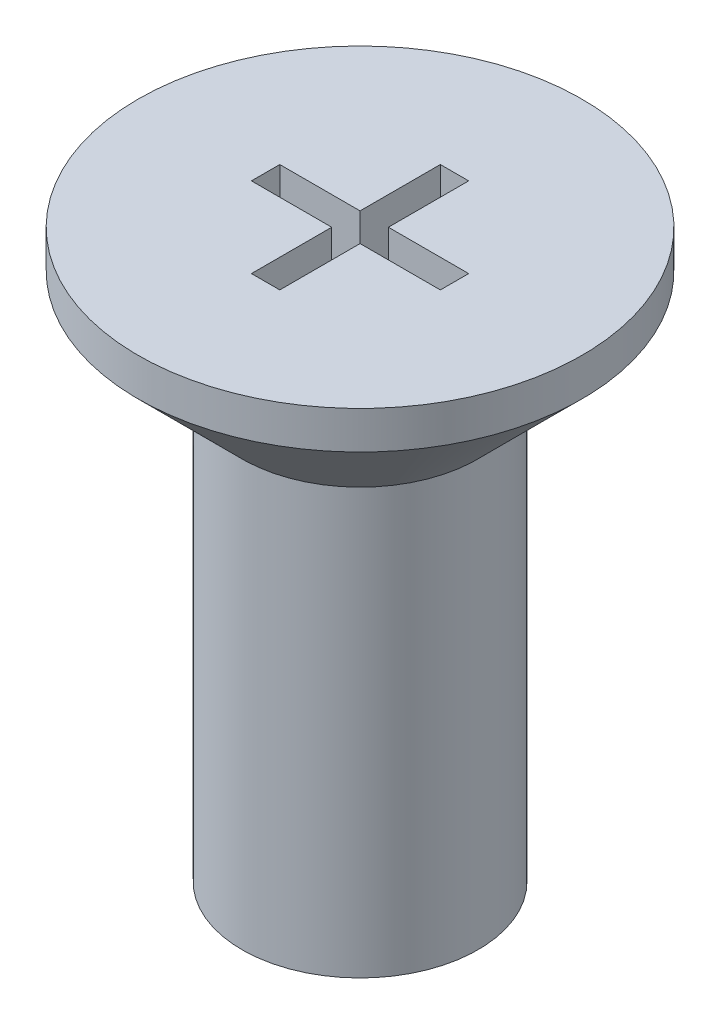
ISO-10303-21;
HEADER;
FILE_DESCRIPTION(('STEP AP214'),'2;1');
FILE_NAME('part.step','',(''),(''),'','','');
FILE_SCHEMA(('AUTOMOTIVE_DESIGN { 1 0 10303 214 1 1 1 1 }'));
ENDSEC;
DATA;
#1=APPLICATION_CONTEXT('core data for automotive mechanical design processes');
#2=APPLICATION_PROTOCOL_DEFINITION('international standard','automotive_design',2000,#1);
#3=PRODUCT_CONTEXT('',#1,'mechanical');
#4=PRODUCT('Part','Part','',(#3));
#5=PRODUCT_RELATED_PRODUCT_CATEGORY('part','',(#4));
#6=PRODUCT_DEFINITION_FORMATION('','',#4);
#7=PRODUCT_DEFINITION_CONTEXT('part definition',#1,'design');
#8=PRODUCT_DEFINITION('design','',#6,#7);
#9=PRODUCT_DEFINITION_SHAPE('','',#8);
#10=(LENGTH_UNIT() NAMED_UNIT(*) SI_UNIT(.MILLI.,.METRE.));
#11=(NAMED_UNIT(*) PLANE_ANGLE_UNIT() SI_UNIT($,.RADIAN.));
#12=(NAMED_UNIT(*) SI_UNIT($,.STERADIAN.) SOLID_ANGLE_UNIT());
#13=UNCERTAINTY_MEASURE_WITH_UNIT(LENGTH_MEASURE(1.E-05),#10,'distance_accuracy_value','');
#14=(GEOMETRIC_REPRESENTATION_CONTEXT(3) GLOBAL_UNCERTAINTY_ASSIGNED_CONTEXT((#13)) GLOBAL_UNIT_ASSIGNED_CONTEXT((#10,
#11,#12)) REPRESENTATION_CONTEXT('',''));
#15=CARTESIAN_POINT('',(0.,0.,0.));
#16=DIRECTION('',(0.,0.,1.));
#17=DIRECTION('',(1.,0.,0.));
#18=AXIS2_PLACEMENT_3D('',#15,#16,#17);
#19=CARTESIAN_POINT('',(0.,0.,0.));
#20=DIRECTION('',(0.,1.,0.));
#21=DIRECTION('',(-1.,0.,0.));
#22=AXIS2_PLACEMENT_3D('',#19,#20,#21);
#23=PLANE('',#22);
#24=CARTESIAN_POINT('',(0.,0.,0.));
#25=DIRECTION('',(0.,1.,0.));
#26=DIRECTION('',(-1.,0.,0.));
#27=AXIS2_PLACEMENT_3D('',#24,#25,#26);
#28=CIRCLE('',#27,1.25);
#29=CARTESIAN_POINT('',(-1.25,0.,0.));
#30=VERTEX_POINT('',#29);
#31=EDGE_CURVE('E11',#30,#30,#28,.T.);
#32=ORIENTED_EDGE('',*,*,#31,.F.);
#33=EDGE_LOOP('',(#32));
#34=FACE_BOUND('',#33,.T.);
#35=ADVANCED_FACE('F33',(#34),#23,.F.);
#36=CARTESIAN_POINT('',(0.,6.,0.));
#37=DIRECTION('',(0.,1.,0.));
#38=DIRECTION('',(-1.,0.,0.));
#39=AXIS2_PLACEMENT_3D('',#36,#37,#38);
#40=CYLINDRICAL_SURFACE('',#39,1.25);
#41=CARTESIAN_POINT('',(0.,4.5,0.));
#42=DIRECTION('',(0.,1.,0.));
#43=DIRECTION('',(-1.,0.,0.));
#44=AXIS2_PLACEMENT_3D('',#41,#42,#43);
#45=CIRCLE('',#44,1.25);
#46=CARTESIAN_POINT('',(-1.25,4.5,0.));
#47=VERTEX_POINT('',#46);
#48=EDGE_CURVE('E40',#47,#47,#45,.T.);
#49=ORIENTED_EDGE('',*,*,#48,.F.);
#50=EDGE_LOOP('',(#49));
#51=FACE_BOUND('',#50,.T.);
#52=ORIENTED_EDGE('',*,*,#31,.T.);
#53=EDGE_LOOP('',(#52));
#54=FACE_BOUND('',#53,.T.);
#55=ADVANCED_FACE('F214',(#51,#54),#40,.T.);
#56=CARTESIAN_POINT('',(0.,4.5,0.));
#57=DIRECTION('',(0.,1.,0.));
#58=DIRECTION('',(-1.,0.,0.));
#59=AXIS2_PLACEMENT_3D('',#56,#57,#58);
#60=CONICAL_SURFACE('',#59,1.25,0.78539816339745);
#61=CARTESIAN_POINT('',(0.,5.6,0.));
#62=DIRECTION('',(0.,1.,0.));
#63=DIRECTION('',(-1.,0.,0.));
#64=AXIS2_PLACEMENT_3D('',#61,#62,#63);
#65=CIRCLE('',#64,2.35);
#66=CARTESIAN_POINT('',(-2.35,5.6,0.));
#67=VERTEX_POINT('',#66);
#68=EDGE_CURVE('E207',#67,#67,#65,.T.);
#69=ORIENTED_EDGE('',*,*,#68,.F.);
#70=EDGE_LOOP('',(#69));
#71=FACE_BOUND('',#70,.T.);
#72=ORIENTED_EDGE('',*,*,#48,.T.);
#73=EDGE_LOOP('',(#72));
#74=FACE_BOUND('',#73,.T.);
#75=ADVANCED_FACE('F212',(#71,#74),#60,.T.);
#76=CARTESIAN_POINT('',(0.,6.,0.));
#77=DIRECTION('',(0.,1.,0.));
#78=DIRECTION('',(-1.,0.,0.));
#79=AXIS2_PLACEMENT_3D('',#76,#77,#78);
#80=CYLINDRICAL_SURFACE('',#79,2.35);
#81=CARTESIAN_POINT('',(0.,6.,0.));
#82=DIRECTION('',(0.,1.,0.));
#83=DIRECTION('',(-1.,0.,0.));
#84=AXIS2_PLACEMENT_3D('',#81,#82,#83);
#85=CIRCLE('',#84,2.35);
#86=CARTESIAN_POINT('',(-2.35,6.,0.));
#87=VERTEX_POINT('',#86);
#88=EDGE_CURVE('E187',#87,#87,#85,.T.);
#89=ORIENTED_EDGE('',*,*,#88,.F.);
#90=EDGE_LOOP('',(#89));
#91=FACE_BOUND('',#90,.T.);
#92=ORIENTED_EDGE('',*,*,#68,.T.);
#93=EDGE_LOOP('',(#92));
#94=FACE_BOUND('',#93,.T.);
#95=ADVANCED_FACE('F232',(#91,#94),#80,.T.);
#96=CARTESIAN_POINT('',(2.35,6.,0.));
#97=DIRECTION('',(0.,-1.,0.));
#98=DIRECTION('',(1.,0.,0.));
#99=AXIS2_PLACEMENT_3D('',#96,#97,#98);
#100=PLANE('',#99);
#101=DIRECTION('',(0.,0.,1.));
#102=VECTOR('',#101,1.);
#103=CARTESIAN_POINT('',(-0.15,6.,-0.15));
#104=LINE('',#103,#102);
#105=CARTESIAN_POINT('',(-0.15,6.,-1.));
#106=VERTEX_POINT('',#105);
#107=CARTESIAN_POINT('',(-0.15,6.,-0.15));
#108=VERTEX_POINT('',#107);
#109=EDGE_CURVE('E156',#106,#108,#104,.T.);
#110=ORIENTED_EDGE('',*,*,#109,.F.);
#111=DIRECTION('',(-1.,0.,0.));
#112=VECTOR('',#111,1.);
#113=CARTESIAN_POINT('',(0.,6.,-1.));
#114=LINE('',#113,#112);
#115=CARTESIAN_POINT('',(0.15,6.,-1.));
#116=VERTEX_POINT('',#115);
#117=EDGE_CURVE('E184',#116,#106,#114,.T.);
#118=ORIENTED_EDGE('',*,*,#117,.F.);
#119=DIRECTION('',(0.,0.,-1.));
#120=VECTOR('',#119,1.);
#121=CARTESIAN_POINT('',(0.15,6.,-1.));
#122=LINE('',#121,#120);
#123=CARTESIAN_POINT('',(0.15,6.,-0.15));
#124=VERTEX_POINT('',#123);
#125=EDGE_CURVE('E182',#124,#116,#122,.T.);
#126=ORIENTED_EDGE('',*,*,#125,.F.);
#127=DIRECTION('',(-1.,0.,0.));
#128=VECTOR('',#127,1.);
#129=CARTESIAN_POINT('',(0.15,6.,-0.15));
#130=LINE('',#129,#128);
#131=CARTESIAN_POINT('',(1.,6.,-0.15));
#132=VERTEX_POINT('',#131);
#133=EDGE_CURVE('E180',#132,#124,#130,.T.);
#134=ORIENTED_EDGE('',*,*,#133,.F.);
#135=DIRECTION('',(0.,0.,-1.));
#136=VECTOR('',#135,1.);
#137=CARTESIAN_POINT('',(1.,6.,-0.15));
#138=LINE('',#137,#136);
#139=CARTESIAN_POINT('',(1.,6.,0.15));
#140=VERTEX_POINT('',#139);
#141=EDGE_CURVE('E131',#140,#132,#138,.T.);
#142=ORIENTED_EDGE('',*,*,#141,.F.);
#143=DIRECTION('',(1.,0.,0.));
#144=VECTOR('',#143,1.);
#145=CARTESIAN_POINT('',(1.,6.,0.15));
#146=LINE('',#145,#144);
#147=CARTESIAN_POINT('',(0.15,6.,0.15));
#148=VERTEX_POINT('',#147);
#149=EDGE_CURVE('E176',#148,#140,#146,.T.);
#150=ORIENTED_EDGE('',*,*,#149,.F.);
#151=DIRECTION('',(0.,0.,-1.));
#152=VECTOR('',#151,1.);
#153=CARTESIAN_POINT('',(0.15,6.,0.15));
#154=LINE('',#153,#152);
#155=CARTESIAN_POINT('',(0.15,6.,1.));
#156=VERTEX_POINT('',#155);
#157=EDGE_CURVE('E173',#156,#148,#154,.T.);
#158=ORIENTED_EDGE('',*,*,#157,.F.);
#159=DIRECTION('',(1.,0.,0.));
#160=VECTOR('',#159,1.);
#161=CARTESIAN_POINT('',(0.15,6.,1.));
#162=LINE('',#161,#160);
#163=CARTESIAN_POINT('',(-0.15,6.,1.));
#164=VERTEX_POINT('',#163);
#165=EDGE_CURVE('E170',#164,#156,#162,.T.);
#166=ORIENTED_EDGE('',*,*,#165,.F.);
#167=DIRECTION('',(0.,0.,1.));
#168=VECTOR('',#167,1.);
#169=CARTESIAN_POINT('',(-0.15,6.,1.));
#170=LINE('',#169,#168);
#171=CARTESIAN_POINT('',(-0.15,6.,0.15));
#172=VERTEX_POINT('',#171);
#173=EDGE_CURVE('E167',#172,#164,#170,.T.);
#174=ORIENTED_EDGE('',*,*,#173,.F.);
#175=DIRECTION('',(1.,0.,0.));
#176=VECTOR('',#175,1.);
#177=CARTESIAN_POINT('',(-0.15,6.,0.15));
#178=LINE('',#177,#176);
#179=CARTESIAN_POINT('',(-1.,6.,0.15));
#180=VERTEX_POINT('',#179);
#181=EDGE_CURVE('E164',#180,#172,#178,.T.);
#182=ORIENTED_EDGE('',*,*,#181,.F.);
#183=DIRECTION('',(0.,0.,1.));
#184=VECTOR('',#183,1.);
#185=CARTESIAN_POINT('',(-1.,6.,0.15));
#186=LINE('',#185,#184);
#187=CARTESIAN_POINT('',(-1.,6.,-0.15));
#188=VERTEX_POINT('',#187);
#189=EDGE_CURVE('E161',#188,#180,#186,.T.);
#190=ORIENTED_EDGE('',*,*,#189,.F.);
#191=DIRECTION('',(-1.,0.,0.));
#192=VECTOR('',#191,1.);
#193=CARTESIAN_POINT('',(-1.,6.,-0.15));
#194=LINE('',#193,#192);
#195=EDGE_CURVE('E158',#108,#188,#194,.T.);
#196=ORIENTED_EDGE('',*,*,#195,.F.);
#197=EDGE_LOOP('',(#110,#118,#126,#134,#142,#150,#158,#166,#174,#182,#190,#196));
#198=FACE_BOUND('',#197,.T.);
#199=ORIENTED_EDGE('',*,*,#88,.T.);
#200=EDGE_LOOP('',(#199));
#201=FACE_BOUND('',#200,.T.);
#202=ADVANCED_FACE('F240',(#198,#201),#100,.F.);
#203=CARTESIAN_POINT('',(0.,5.,-1.));
#204=DIRECTION('',(0.,0.,-1.));
#205=DIRECTION('',(-1.,0.,0.));
#206=AXIS2_PLACEMENT_3D('',#203,#204,#205);
#207=PLANE('',#206);
#208=ORIENTED_EDGE('',*,*,#117,.T.);
#209=DIRECTION('',(0.,1.,0.));
#210=VECTOR('',#209,1.);
#211=CARTESIAN_POINT('',(-0.15,5.,-1.));
#212=LINE('',#211,#210);
#213=CARTESIAN_POINT('',(-0.15,5.,-1.));
#214=VERTEX_POINT('',#213);
#215=EDGE_CURVE('E47',#214,#106,#212,.T.);
#216=ORIENTED_EDGE('',*,*,#215,.F.);
#217=DIRECTION('',(-1.,0.,0.));
#218=VECTOR('',#217,1.);
#219=CARTESIAN_POINT('',(-0.15,5.,-1.));
#220=LINE('',#219,#218);
#221=CARTESIAN_POINT('',(0.15,5.,-1.));
#222=VERTEX_POINT('',#221);
#223=EDGE_CURVE('E55',#222,#214,#220,.T.);
#224=ORIENTED_EDGE('',*,*,#223,.F.);
#225=DIRECTION('',(0.,1.,0.));
#226=VECTOR('',#225,1.);
#227=CARTESIAN_POINT('',(0.15,5.,-1.));
#228=LINE('',#227,#226);
#229=EDGE_CURVE('E93',#222,#116,#228,.T.);
#230=ORIENTED_EDGE('',*,*,#229,.T.);
#231=EDGE_LOOP('',(#208,#216,#224,#230));
#232=FACE_BOUND('',#231,.T.);
#233=ADVANCED_FACE('F248',(#232),#207,.F.);
#234=CARTESIAN_POINT('',(0.15,5.,-1.));
#235=DIRECTION('',(1.,0.,0.));
#236=DIRECTION('',(0.,0.,-1.));
#237=AXIS2_PLACEMENT_3D('',#234,#235,#236);
#238=PLANE('',#237);
#239=ORIENTED_EDGE('',*,*,#125,.T.);
#240=ORIENTED_EDGE('',*,*,#229,.F.);
#241=DIRECTION('',(0.,0.,-1.));
#242=VECTOR('',#241,1.);
#243=CARTESIAN_POINT('',(0.15,5.,-1.));
#244=LINE('',#243,#242);
#245=CARTESIAN_POINT('',(0.15,5.,-0.15));
#246=VERTEX_POINT('',#245);
#247=EDGE_CURVE('E144',#246,#222,#244,.T.);
#248=ORIENTED_EDGE('',*,*,#247,.F.);
#249=DIRECTION('',(0.,1.,0.));
#250=VECTOR('',#249,1.);
#251=CARTESIAN_POINT('',(0.15,5.,-0.15));
#252=LINE('',#251,#250);
#253=EDGE_CURVE('E135',#246,#124,#252,.T.);
#254=ORIENTED_EDGE('',*,*,#253,.T.);
#255=EDGE_LOOP('',(#239,#240,#248,#254));
#256=FACE_BOUND('',#255,.T.);
#257=ADVANCED_FACE('F256',(#256),#238,.F.);
#258=CARTESIAN_POINT('',(0.15,5.,-0.15));
#259=DIRECTION('',(0.,0.,-1.));
#260=DIRECTION('',(-1.,0.,0.));
#261=AXIS2_PLACEMENT_3D('',#258,#259,#260);
#262=PLANE('',#261);
#263=ORIENTED_EDGE('',*,*,#133,.T.);
#264=ORIENTED_EDGE('',*,*,#253,.F.);
#265=DIRECTION('',(-1.,0.,0.));
#266=VECTOR('',#265,1.);
#267=CARTESIAN_POINT('',(0.15,5.,-0.15));
#268=LINE('',#267,#266);
#269=CARTESIAN_POINT('',(1.,5.,-0.15));
#270=VERTEX_POINT('',#269);
#271=EDGE_CURVE('E139',#270,#246,#268,.T.);
#272=ORIENTED_EDGE('',*,*,#271,.F.);
#273=DIRECTION('',(0.,1.,0.));
#274=VECTOR('',#273,1.);
#275=CARTESIAN_POINT('',(1.,5.,-0.15));
#276=LINE('',#275,#274);
#277=EDGE_CURVE('E124',#270,#132,#276,.T.);
#278=ORIENTED_EDGE('',*,*,#277,.T.);
#279=EDGE_LOOP('',(#263,#264,#272,#278));
#280=FACE_BOUND('',#279,.T.);
#281=ADVANCED_FACE('F140',(#280),#262,.F.);
#282=CARTESIAN_POINT('',(1.,5.,-0.15));
#283=DIRECTION('',(1.,0.,0.));
#284=DIRECTION('',(0.,1.,0.));
#285=AXIS2_PLACEMENT_3D('',#282,#283,#284);
#286=PLANE('',#285);
#287=ORIENTED_EDGE('',*,*,#141,.T.);
#288=ORIENTED_EDGE('',*,*,#277,.F.);
#289=DIRECTION('',(0.,0.,-1.));
#290=VECTOR('',#289,1.);
#291=CARTESIAN_POINT('',(1.,5.,-0.15));
#292=LINE('',#291,#290);
#293=CARTESIAN_POINT('',(1.,5.,0.15));
#294=VERTEX_POINT('',#293);
#295=EDGE_CURVE('E128',#294,#270,#292,.T.);
#296=ORIENTED_EDGE('',*,*,#295,.F.);
#297=DIRECTION('',(0.,1.,0.));
#298=VECTOR('',#297,1.);
#299=CARTESIAN_POINT('',(1.,5.,0.15));
#300=LINE('',#299,#298);
#301=EDGE_CURVE('E136',#294,#140,#300,.T.);
#302=ORIENTED_EDGE('',*,*,#301,.T.);
#303=EDGE_LOOP('',(#287,#288,#296,#302));
#304=FACE_BOUND('',#303,.T.);
#305=ADVANCED_FACE('F126',(#304),#286,.F.);
#306=CARTESIAN_POINT('',(1.,5.,0.15));
#307=DIRECTION('',(0.,0.,1.));
#308=DIRECTION('',(1.,0.,0.));
#309=AXIS2_PLACEMENT_3D('',#306,#307,#308);
#310=PLANE('',#309);
#311=ORIENTED_EDGE('',*,*,#149,.T.);
#312=ORIENTED_EDGE('',*,*,#301,.F.);
#313=DIRECTION('',(1.,0.,0.));
#314=VECTOR('',#313,1.);
#315=CARTESIAN_POINT('',(1.,5.,0.15));
#316=LINE('',#315,#314);
#317=CARTESIAN_POINT('',(0.15,5.,0.15));
#318=VERTEX_POINT('',#317);
#319=EDGE_CURVE('E149',#318,#294,#316,.T.);
#320=ORIENTED_EDGE('',*,*,#319,.F.);
#321=DIRECTION('',(0.,1.,0.));
#322=VECTOR('',#321,1.);
#323=CARTESIAN_POINT('',(0.15,5.,0.15));
#324=LINE('',#323,#322);
#325=EDGE_CURVE('E190',#318,#148,#324,.T.);
#326=ORIENTED_EDGE('',*,*,#325,.T.);
#327=EDGE_LOOP('',(#311,#312,#320,#326));
#328=FACE_BOUND('',#327,.T.);
#329=ADVANCED_FACE('F276',(#328),#310,.F.);
#330=CARTESIAN_POINT('',(0.15,5.,0.15));
#331=DIRECTION('',(1.,0.,0.));
#332=DIRECTION('',(0.,0.,-1.));
#333=AXIS2_PLACEMENT_3D('',#330,#331,#332);
#334=PLANE('',#333);
#335=ORIENTED_EDGE('',*,*,#157,.T.);
#336=ORIENTED_EDGE('',*,*,#325,.F.);
#337=DIRECTION('',(0.,0.,-1.));
#338=VECTOR('',#337,1.);
#339=CARTESIAN_POINT('',(0.15,5.,0.15));
#340=LINE('',#339,#338);
#341=CARTESIAN_POINT('',(0.15,5.,1.));
#342=VERTEX_POINT('',#341);
#343=EDGE_CURVE('E151',#342,#318,#340,.T.);
#344=ORIENTED_EDGE('',*,*,#343,.F.);
#345=DIRECTION('',(0.,1.,0.));
#346=VECTOR('',#345,1.);
#347=CARTESIAN_POINT('',(0.15,5.,1.));
#348=LINE('',#347,#346);
#349=EDGE_CURVE('E192',#342,#156,#348,.T.);
#350=ORIENTED_EDGE('',*,*,#349,.T.);
#351=EDGE_LOOP('',(#335,#336,#344,#350));
#352=FACE_BOUND('',#351,.T.);
#353=ADVANCED_FACE('F283',(#352),#334,.F.);
#354=CARTESIAN_POINT('',(0.15,5.,1.));
#355=DIRECTION('',(0.,0.,1.));
#356=DIRECTION('',(1.,0.,0.));
#357=AXIS2_PLACEMENT_3D('',#354,#355,#356);
#358=PLANE('',#357);
#359=ORIENTED_EDGE('',*,*,#165,.T.);
#360=ORIENTED_EDGE('',*,*,#349,.F.);
#361=DIRECTION('',(1.,0.,0.));
#362=VECTOR('',#361,1.);
#363=CARTESIAN_POINT('',(0.15,5.,1.));
#364=LINE('',#363,#362);
#365=CARTESIAN_POINT('',(-0.15,5.,1.));
#366=VERTEX_POINT('',#365);
#367=EDGE_CURVE('E411',#366,#342,#364,.T.);
#368=ORIENTED_EDGE('',*,*,#367,.F.);
#369=DIRECTION('',(0.,1.,0.));
#370=VECTOR('',#369,1.);
#371=CARTESIAN_POINT('',(-0.15,5.,1.));
#372=LINE('',#371,#370);
#373=EDGE_CURVE('E194',#366,#164,#372,.T.);
#374=ORIENTED_EDGE('',*,*,#373,.T.);
#375=EDGE_LOOP('',(#359,#360,#368,#374));
#376=FACE_BOUND('',#375,.T.);
#377=ADVANCED_FACE('F291',(#376),#358,.F.);
#378=CARTESIAN_POINT('',(-0.15,5.,1.));
#379=DIRECTION('',(-1.,0.,0.));
#380=DIRECTION('',(0.,-1.,0.));
#381=AXIS2_PLACEMENT_3D('',#378,#379,#380);
#382=PLANE('',#381);
#383=ORIENTED_EDGE('',*,*,#173,.T.);
#384=ORIENTED_EDGE('',*,*,#373,.F.);
#385=DIRECTION('',(0.,0.,1.));
#386=VECTOR('',#385,1.);
#387=CARTESIAN_POINT('',(-0.15,5.,1.));
#388=LINE('',#387,#386);
#389=CARTESIAN_POINT('',(-0.15,5.,0.15));
#390=VERTEX_POINT('',#389);
#391=EDGE_CURVE('E408',#390,#366,#388,.T.);
#392=ORIENTED_EDGE('',*,*,#391,.F.);
#393=DIRECTION('',(0.,1.,0.));
#394=VECTOR('',#393,1.);
#395=CARTESIAN_POINT('',(-0.15,5.,0.15));
#396=LINE('',#395,#394);
#397=EDGE_CURVE('E196',#390,#172,#396,.T.);
#398=ORIENTED_EDGE('',*,*,#397,.T.);
#399=EDGE_LOOP('',(#383,#384,#392,#398));
#400=FACE_BOUND('',#399,.T.);
#401=ADVANCED_FACE('F299',(#400),#382,.F.);
#402=CARTESIAN_POINT('',(-0.15,5.,0.15));
#403=DIRECTION('',(0.,0.,1.));
#404=DIRECTION('',(1.,0.,0.));
#405=AXIS2_PLACEMENT_3D('',#402,#403,#404);
#406=PLANE('',#405);
#407=ORIENTED_EDGE('',*,*,#181,.T.);
#408=ORIENTED_EDGE('',*,*,#397,.F.);
#409=DIRECTION('',(1.,0.,0.));
#410=VECTOR('',#409,1.);
#411=CARTESIAN_POINT('',(-0.15,5.,0.15));
#412=LINE('',#411,#410);
#413=CARTESIAN_POINT('',(-1.,5.,0.15));
#414=VERTEX_POINT('',#413);
#415=EDGE_CURVE('E405',#414,#390,#412,.T.);
#416=ORIENTED_EDGE('',*,*,#415,.F.);
#417=DIRECTION('',(0.,1.,0.));
#418=VECTOR('',#417,1.);
#419=CARTESIAN_POINT('',(-1.,5.,0.15));
#420=LINE('',#419,#418);
#421=EDGE_CURVE('E198',#414,#180,#420,.T.);
#422=ORIENTED_EDGE('',*,*,#421,.T.);
#423=EDGE_LOOP('',(#407,#408,#416,#422));
#424=FACE_BOUND('',#423,.T.);
#425=ADVANCED_FACE('F307',(#424),#406,.F.);
#426=CARTESIAN_POINT('',(-1.,5.,0.15));
#427=DIRECTION('',(-1.,0.,0.));
#428=DIRECTION('',(0.,-1.,0.));
#429=AXIS2_PLACEMENT_3D('',#426,#427,#428);
#430=PLANE('',#429);
#431=ORIENTED_EDGE('',*,*,#189,.T.);
#432=ORIENTED_EDGE('',*,*,#421,.F.);
#433=DIRECTION('',(0.,0.,1.));
#434=VECTOR('',#433,1.);
#435=CARTESIAN_POINT('',(-1.,5.,0.15));
#436=LINE('',#435,#434);
#437=CARTESIAN_POINT('',(-1.,5.,-0.15));
#438=VERTEX_POINT('',#437);
#439=EDGE_CURVE('E398',#438,#414,#436,.T.);
#440=ORIENTED_EDGE('',*,*,#439,.F.);
#441=DIRECTION('',(0.,1.,0.));
#442=VECTOR('',#441,1.);
#443=CARTESIAN_POINT('',(-1.,5.,-0.15));
#444=LINE('',#443,#442);
#445=EDGE_CURVE('E200',#438,#188,#444,.T.);
#446=ORIENTED_EDGE('',*,*,#445,.T.);
#447=EDGE_LOOP('',(#431,#432,#440,#446));
#448=FACE_BOUND('',#447,.T.);
#449=ADVANCED_FACE('F315',(#448),#430,.F.);
#450=CARTESIAN_POINT('',(-1.,5.,-0.15));
#451=DIRECTION('',(0.,0.,-1.));
#452=DIRECTION('',(-1.,0.,0.));
#453=AXIS2_PLACEMENT_3D('',#450,#451,#452);
#454=PLANE('',#453);
#455=ORIENTED_EDGE('',*,*,#195,.T.);
#456=ORIENTED_EDGE('',*,*,#445,.F.);
#457=DIRECTION('',(-1.,0.,0.));
#458=VECTOR('',#457,1.);
#459=CARTESIAN_POINT('',(-1.,5.,-0.15));
#460=LINE('',#459,#458);
#461=CARTESIAN_POINT('',(-0.15,5.,-0.15));
#462=VERTEX_POINT('',#461);
#463=EDGE_CURVE('E395',#462,#438,#460,.T.);
#464=ORIENTED_EDGE('',*,*,#463,.F.);
#465=DIRECTION('',(0.,1.,0.));
#466=VECTOR('',#465,1.);
#467=CARTESIAN_POINT('',(-0.15,5.,-0.15));
#468=LINE('',#467,#466);
#469=EDGE_CURVE('E202',#462,#108,#468,.T.);
#470=ORIENTED_EDGE('',*,*,#469,.T.);
#471=EDGE_LOOP('',(#455,#456,#464,#470));
#472=FACE_BOUND('',#471,.T.);
#473=ADVANCED_FACE('F323',(#472),#454,.F.);
#474=CARTESIAN_POINT('',(-0.15,5.,-0.15));
#475=DIRECTION('',(-1.,0.,0.));
#476=DIRECTION('',(0.,0.,1.));
#477=AXIS2_PLACEMENT_3D('',#474,#475,#476);
#478=PLANE('',#477);
#479=ORIENTED_EDGE('',*,*,#109,.T.);
#480=ORIENTED_EDGE('',*,*,#469,.F.);
#481=DIRECTION('',(0.,0.,1.));
#482=VECTOR('',#481,1.);
#483=CARTESIAN_POINT('',(-0.15,5.,-0.15));
#484=LINE('',#483,#482);
#485=EDGE_CURVE('E399',#214,#462,#484,.T.);
#486=ORIENTED_EDGE('',*,*,#485,.F.);
#487=ORIENTED_EDGE('',*,*,#215,.T.);
#488=EDGE_LOOP('',(#479,#480,#486,#487));
#489=FACE_BOUND('',#488,.T.);
#490=ADVANCED_FACE('F331',(#489),#478,.F.);
#491=CARTESIAN_POINT('',(0.,5.,0.));
#492=DIRECTION('',(0.,-1.,0.));
#493=DIRECTION('',(0.,0.,-1.));
#494=AXIS2_PLACEMENT_3D('',#491,#492,#493);
#495=PLANE('',#494);
#496=ORIENTED_EDGE('',*,*,#223,.T.);
#497=ORIENTED_EDGE('',*,*,#485,.T.);
#498=ORIENTED_EDGE('',*,*,#463,.T.);
#499=ORIENTED_EDGE('',*,*,#439,.T.);
#500=ORIENTED_EDGE('',*,*,#415,.T.);
#501=ORIENTED_EDGE('',*,*,#391,.T.);
#502=ORIENTED_EDGE('',*,*,#367,.T.);
#503=ORIENTED_EDGE('',*,*,#343,.T.);
#504=ORIENTED_EDGE('',*,*,#319,.T.);
#505=ORIENTED_EDGE('',*,*,#295,.T.);
#506=ORIENTED_EDGE('',*,*,#271,.T.);
#507=ORIENTED_EDGE('',*,*,#247,.T.);
#508=EDGE_LOOP('',(#496,#497,#498,#499,#500,#501,#502,#503,#504,#505,#506,#507));
#509=FACE_BOUND('',#508,.T.);
#510=ADVANCED_FACE('F146',(#509),#495,.F.);
#511=CLOSED_SHELL('',(#35,#55,#75,#95,#202,#233,#257,#281,#305,#329,#353,#377,#401,#425,#449,
#473,#490,#510));
#512=MANIFOLD_SOLID_BREP('B2',#511);
#513=ADVANCED_BREP_SHAPE_REPRESENTATION('',(#18,#512),#14);
#514=SHAPE_DEFINITION_REPRESENTATION(#9,#513);
ENDSEC;
END-ISO-10303-21;
